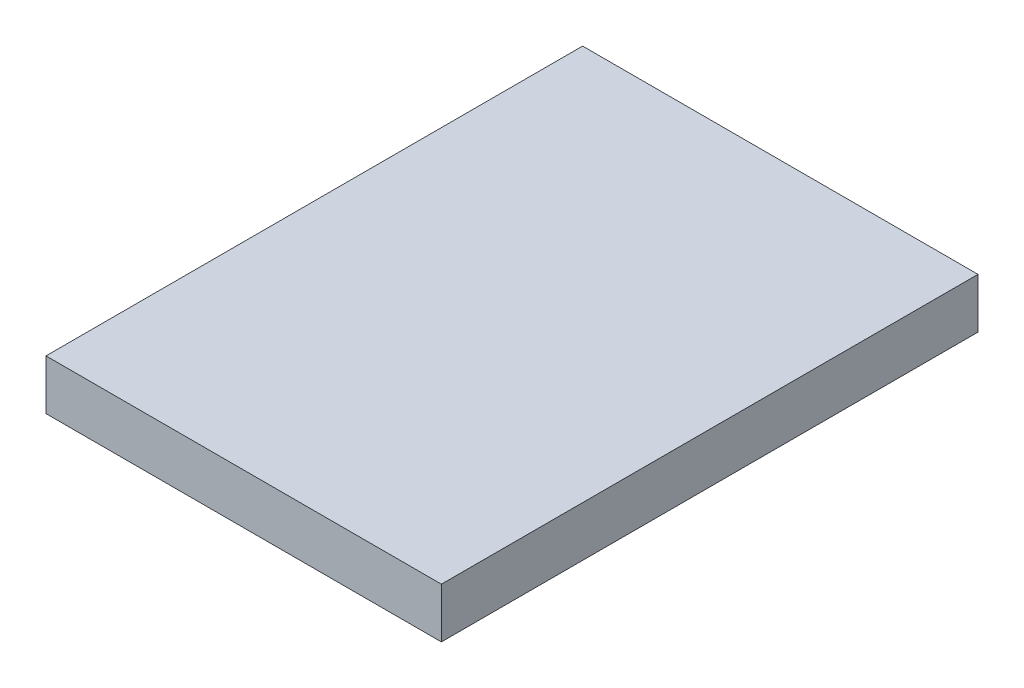
ISO-10303-21;
HEADER;
FILE_DESCRIPTION(('STEP AP214'),'2;1');
FILE_NAME('part.step','',(''),(''),'','','');
FILE_SCHEMA(('AUTOMOTIVE_DESIGN { 1 0 10303 214 1 1 1 1 }'));
ENDSEC;
DATA;
#1=APPLICATION_CONTEXT('core data for automotive mechanical design processes');
#2=APPLICATION_PROTOCOL_DEFINITION('international standard','automotive_design',2000,#1);
#3=PRODUCT_CONTEXT('',#1,'mechanical');
#4=PRODUCT('Part','Part','',(#3));
#5=PRODUCT_RELATED_PRODUCT_CATEGORY('part','',(#4));
#6=PRODUCT_DEFINITION_FORMATION('','',#4);
#7=PRODUCT_DEFINITION_CONTEXT('part definition',#1,'design');
#8=PRODUCT_DEFINITION('design','',#6,#7);
#9=PRODUCT_DEFINITION_SHAPE('','',#8);
#10=(LENGTH_UNIT() NAMED_UNIT(*) SI_UNIT(.MILLI.,.METRE.));
#11=(NAMED_UNIT(*) PLANE_ANGLE_UNIT() SI_UNIT($,.RADIAN.));
#12=(NAMED_UNIT(*) SI_UNIT($,.STERADIAN.) SOLID_ANGLE_UNIT());
#13=UNCERTAINTY_MEASURE_WITH_UNIT(LENGTH_MEASURE(1.E-05),#10,'distance_accuracy_value','');
#14=(GEOMETRIC_REPRESENTATION_CONTEXT(3) GLOBAL_UNCERTAINTY_ASSIGNED_CONTEXT((#13)) GLOBAL_UNIT_ASSIGNED_CONTEXT((#10,
#11,#12)) REPRESENTATION_CONTEXT('',''));
#15=CARTESIAN_POINT('',(0.,0.,0.));
#16=DIRECTION('',(0.,0.,1.));
#17=DIRECTION('',(1.,0.,0.));
#18=AXIS2_PLACEMENT_3D('',#15,#16,#17);
#19=CARTESIAN_POINT('',(7.1524,2.9756,-1.9685000000001));
#20=DIRECTION('',(1.,0.,0.));
#21=DIRECTION('',(0.,-1.,0.));
#22=AXIS2_PLACEMENT_3D('',#19,#20,#21);
#23=PLANE('',#22);
#24=DIRECTION('',(0.,0.,1.));
#25=VECTOR('',#24,1.);
#26=CARTESIAN_POINT('',(7.1524,2.9306,-1.9685000000001));
#27=LINE('',#26,#25);
#28=CARTESIAN_POINT('',(7.1524,2.9306,-2.4511000000001));
#29=VERTEX_POINT('',#28);
#30=CARTESIAN_POINT('',(7.1524,2.9306,-1.9685000000001));
#31=VERTEX_POINT('',#30);
#32=EDGE_CURVE('E11',#29,#31,#27,.T.);
#33=ORIENTED_EDGE('',*,*,#32,.T.);
#34=DIRECTION('',(0.,-1.,0.));
#35=VECTOR('',#34,1.);
#36=CARTESIAN_POINT('',(7.1524,2.9756,-1.9685000000001));
#37=LINE('',#36,#35);
#38=CARTESIAN_POINT('',(7.1524,2.9756,-1.9685000000001));
#39=VERTEX_POINT('',#38);
#40=EDGE_CURVE('E24',#39,#31,#37,.T.);
#41=ORIENTED_EDGE('',*,*,#40,.F.);
#42=DIRECTION('',(0.,0.,1.));
#43=VECTOR('',#42,1.);
#44=CARTESIAN_POINT('',(7.1524,2.9756,-1.9685000000001));
#45=LINE('',#44,#43);
#46=CARTESIAN_POINT('',(7.1524,2.9756,-2.4511000000001));
#47=VERTEX_POINT('',#46);
#48=EDGE_CURVE('E88',#47,#39,#45,.T.);
#49=ORIENTED_EDGE('',*,*,#48,.F.);
#50=DIRECTION('',(0.,-1.,0.));
#51=VECTOR('',#50,1.);
#52=CARTESIAN_POINT('',(7.1524,2.9756,-2.4511000000001));
#53=LINE('',#52,#51);
#54=EDGE_CURVE('E77',#47,#29,#53,.T.);
#55=ORIENTED_EDGE('',*,*,#54,.T.);
#56=EDGE_LOOP('',(#33,#41,#49,#55));
#57=FACE_BOUND('',#56,.T.);
#58=ADVANCED_FACE('F17',(#57),#23,.F.);
#59=CARTESIAN_POINT('',(7.508,2.9756,-1.9685000000001));
#60=DIRECTION('',(0.,0.,-1.));
#61=DIRECTION('',(0.,1.,0.));
#62=AXIS2_PLACEMENT_3D('',#59,#60,#61);
#63=PLANE('',#62);
#64=DIRECTION('',(1.,0.,0.));
#65=VECTOR('',#64,1.);
#66=CARTESIAN_POINT('',(7.508,2.9306,-1.9685000000001));
#67=LINE('',#66,#65);
#68=CARTESIAN_POINT('',(7.508,2.9306,-1.9685000000001));
#69=VERTEX_POINT('',#68);
#70=EDGE_CURVE('E85',#31,#69,#67,.T.);
#71=ORIENTED_EDGE('',*,*,#70,.T.);
#72=DIRECTION('',(0.,-1.,0.));
#73=VECTOR('',#72,1.);
#74=CARTESIAN_POINT('',(7.508,2.9756,-1.9685000000001));
#75=LINE('',#74,#73);
#76=CARTESIAN_POINT('',(7.508,2.9756,-1.9685000000001));
#77=VERTEX_POINT('',#76);
#78=EDGE_CURVE('E83',#77,#69,#75,.T.);
#79=ORIENTED_EDGE('',*,*,#78,.F.);
#80=DIRECTION('',(1.,0.,0.));
#81=VECTOR('',#80,1.);
#82=CARTESIAN_POINT('',(7.508,2.9756,-1.9685000000001));
#83=LINE('',#82,#81);
#84=EDGE_CURVE('E72',#39,#77,#83,.T.);
#85=ORIENTED_EDGE('',*,*,#84,.F.);
#86=ORIENTED_EDGE('',*,*,#40,.T.);
#87=EDGE_LOOP('',(#71,#79,#85,#86));
#88=FACE_BOUND('',#87,.T.);
#89=ADVANCED_FACE('F90',(#88),#63,.F.);
#90=CARTESIAN_POINT('',(7.508,2.9756,-2.4511000000001));
#91=DIRECTION('',(-1.,0.,0.));
#92=DIRECTION('',(0.,1.,0.));
#93=AXIS2_PLACEMENT_3D('',#90,#91,#92);
#94=PLANE('',#93);
#95=DIRECTION('',(0.,0.,-1.));
#96=VECTOR('',#95,1.);
#97=CARTESIAN_POINT('',(7.508,2.9306,-2.4511000000001));
#98=LINE('',#97,#96);
#99=CARTESIAN_POINT('',(7.508,2.9306,-2.4511000000001));
#100=VERTEX_POINT('',#99);
#101=EDGE_CURVE('E60',#69,#100,#98,.T.);
#102=ORIENTED_EDGE('',*,*,#101,.T.);
#103=DIRECTION('',(0.,-1.,0.));
#104=VECTOR('',#103,1.);
#105=CARTESIAN_POINT('',(7.508,2.9756,-2.4511000000001));
#106=LINE('',#105,#104);
#107=CARTESIAN_POINT('',(7.508,2.9756,-2.4511000000001));
#108=VERTEX_POINT('',#107);
#109=EDGE_CURVE('E54',#108,#100,#106,.T.);
#110=ORIENTED_EDGE('',*,*,#109,.F.);
#111=DIRECTION('',(0.,0.,-1.));
#112=VECTOR('',#111,1.);
#113=CARTESIAN_POINT('',(7.508,2.9756,-2.4511000000001));
#114=LINE('',#113,#112);
#115=EDGE_CURVE('E58',#77,#108,#114,.T.);
#116=ORIENTED_EDGE('',*,*,#115,.F.);
#117=ORIENTED_EDGE('',*,*,#78,.T.);
#118=EDGE_LOOP('',(#102,#110,#116,#117));
#119=FACE_BOUND('',#118,.T.);
#120=ADVANCED_FACE('F56',(#119),#94,.F.);
#121=CARTESIAN_POINT('',(7.1524,2.9756,-2.4511000000001));
#122=DIRECTION('',(0.,0.,1.));
#123=DIRECTION('',(0.,-1.,0.));
#124=AXIS2_PLACEMENT_3D('',#121,#122,#123);
#125=PLANE('',#124);
#126=DIRECTION('',(-1.,0.,0.));
#127=VECTOR('',#126,1.);
#128=CARTESIAN_POINT('',(7.1524,2.9306,-2.4511000000001));
#129=LINE('',#128,#127);
#130=EDGE_CURVE('E73',#100,#29,#129,.T.);
#131=ORIENTED_EDGE('',*,*,#130,.T.);
#132=ORIENTED_EDGE('',*,*,#54,.F.);
#133=DIRECTION('',(-1.,0.,0.));
#134=VECTOR('',#133,1.);
#135=CARTESIAN_POINT('',(7.1524,2.9756,-2.4511000000001));
#136=LINE('',#135,#134);
#137=EDGE_CURVE('E70',#108,#47,#136,.T.);
#138=ORIENTED_EDGE('',*,*,#137,.F.);
#139=ORIENTED_EDGE('',*,*,#109,.T.);
#140=EDGE_LOOP('',(#131,#132,#138,#139));
#141=FACE_BOUND('',#140,.T.);
#142=ADVANCED_FACE('F76',(#141),#125,.F.);
#143=CARTESIAN_POINT('',(0.,2.9756,0.));
#144=DIRECTION('',(0.,-1.,0.));
#145=DIRECTION('',(-1.,0.,0.));
#146=AXIS2_PLACEMENT_3D('',#143,#144,#145);
#147=PLANE('',#146);
#148=ORIENTED_EDGE('',*,*,#48,.T.);
#149=ORIENTED_EDGE('',*,*,#84,.T.);
#150=ORIENTED_EDGE('',*,*,#115,.T.);
#151=ORIENTED_EDGE('',*,*,#137,.T.);
#152=EDGE_LOOP('',(#148,#149,#150,#151));
#153=FACE_BOUND('',#152,.T.);
#154=ADVANCED_FACE('F69',(#153),#147,.F.);
#155=CARTESIAN_POINT('',(0.,2.9306,0.));
#156=DIRECTION('',(0.,-1.,0.));
#157=DIRECTION('',(-1.,0.,0.));
#158=AXIS2_PLACEMENT_3D('',#155,#156,#157);
#159=PLANE('',#158);
#160=ORIENTED_EDGE('',*,*,#32,.F.);
#161=ORIENTED_EDGE('',*,*,#130,.F.);
#162=ORIENTED_EDGE('',*,*,#101,.F.);
#163=ORIENTED_EDGE('',*,*,#70,.F.);
#164=EDGE_LOOP('',(#160,#161,#162,#163));
#165=FACE_BOUND('',#164,.T.);
#166=ADVANCED_FACE('F91',(#165),#159,.T.);
#167=CLOSED_SHELL('',(#58,#89,#120,#142,#154,#166));
#168=MANIFOLD_SOLID_BREP('B1',#167);
#169=ADVANCED_BREP_SHAPE_REPRESENTATION('',(#18,#168),#14);
#170=SHAPE_DEFINITION_REPRESENTATION(#9,#169);
ENDSEC;
END-ISO-10303-21;
